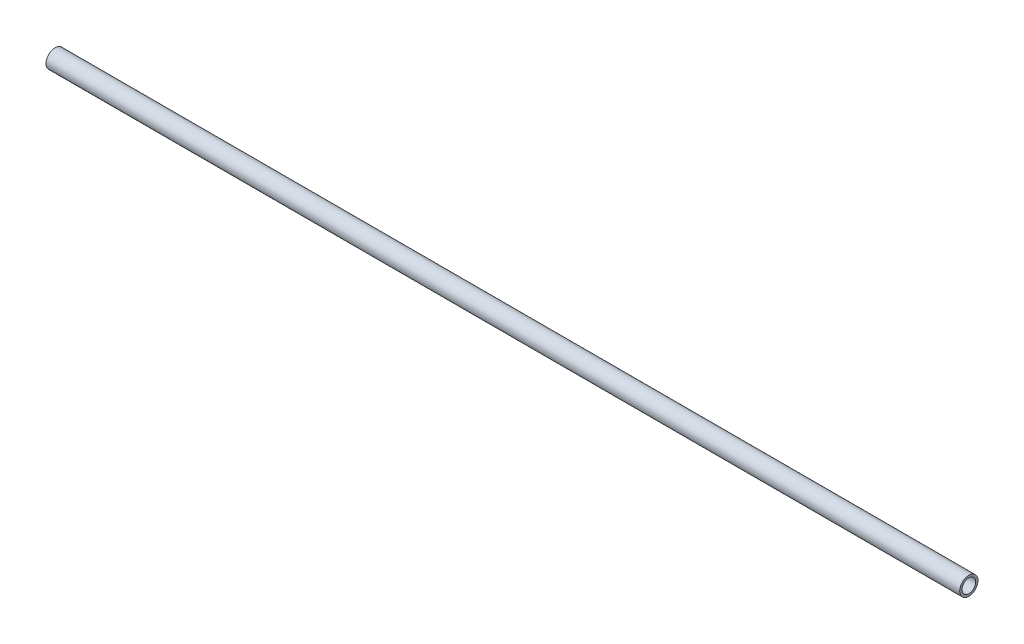
ISO-10303-21;
HEADER;
FILE_DESCRIPTION(('STEP AP214'),'2;1');
FILE_NAME('part.step','',(''),(''),'','','');
FILE_SCHEMA(('AUTOMOTIVE_DESIGN { 1 0 10303 214 1 1 1 1 }'));
ENDSEC;
DATA;
#1=APPLICATION_CONTEXT('core data for automotive mechanical design processes');
#2=APPLICATION_PROTOCOL_DEFINITION('international standard','automotive_design',2000,#1);
#3=PRODUCT_CONTEXT('',#1,'mechanical');
#4=PRODUCT('Part','Part','',(#3));
#5=PRODUCT_RELATED_PRODUCT_CATEGORY('part','',(#4));
#6=PRODUCT_DEFINITION_FORMATION('','',#4);
#7=PRODUCT_DEFINITION_CONTEXT('part definition',#1,'design');
#8=PRODUCT_DEFINITION('design','',#6,#7);
#9=PRODUCT_DEFINITION_SHAPE('','',#8);
#10=(LENGTH_UNIT() NAMED_UNIT(*) SI_UNIT(.MILLI.,.METRE.));
#11=(NAMED_UNIT(*) PLANE_ANGLE_UNIT() SI_UNIT($,.RADIAN.));
#12=(NAMED_UNIT(*) SI_UNIT($,.STERADIAN.) SOLID_ANGLE_UNIT());
#13=UNCERTAINTY_MEASURE_WITH_UNIT(LENGTH_MEASURE(1.E-05),#10,'distance_accuracy_value','');
#14=(GEOMETRIC_REPRESENTATION_CONTEXT(3) GLOBAL_UNCERTAINTY_ASSIGNED_CONTEXT((#13)) GLOBAL_UNIT_ASSIGNED_CONTEXT((#10,
#11,#12)) REPRESENTATION_CONTEXT('',''));
#15=CARTESIAN_POINT('',(0.,0.,0.));
#16=DIRECTION('',(0.,0.,1.));
#17=DIRECTION('',(1.,0.,0.));
#18=AXIS2_PLACEMENT_3D('',#15,#16,#17);
#19=CARTESIAN_POINT('',(200.,0.,0.));
#20=DIRECTION('',(1.,0.,0.));
#21=DIRECTION('',(0.,0.,-1.));
#22=AXIS2_PLACEMENT_3D('',#19,#20,#21);
#23=PLANE('',#22);
#24=CARTESIAN_POINT('',(200.,0.,0.));
#25=DIRECTION('',(1.,0.,0.));
#26=DIRECTION('',(0.,0.,-1.));
#27=AXIS2_PLACEMENT_3D('',#24,#25,#26);
#28=CIRCLE('',#27,4.);
#29=CARTESIAN_POINT('',(200.,0.,-4.));
#30=VERTEX_POINT('',#29);
#31=EDGE_CURVE('E10',#30,#30,#28,.T.);
#32=ORIENTED_EDGE('',*,*,#31,.T.);
#33=EDGE_LOOP('',(#32));
#34=FACE_BOUND('',#33,.T.);
#35=CARTESIAN_POINT('',(200.,0.,0.));
#36=DIRECTION('',(1.,0.,0.));
#37=DIRECTION('',(0.,0.,-1.));
#38=AXIS2_PLACEMENT_3D('',#35,#36,#37);
#39=CIRCLE('',#38,3.);
#40=CARTESIAN_POINT('',(200.,0.,-3.));
#41=VERTEX_POINT('',#40);
#42=EDGE_CURVE('E48',#41,#41,#39,.T.);
#43=ORIENTED_EDGE('',*,*,#42,.F.);
#44=EDGE_LOOP('',(#43));
#45=FACE_BOUND('',#44,.T.);
#46=ADVANCED_FACE('F37',(#34,#45),#23,.T.);
#47=CARTESIAN_POINT('',(-200.,0.,0.));
#48=DIRECTION('',(1.,0.,0.));
#49=DIRECTION('',(0.,0.,-1.));
#50=AXIS2_PLACEMENT_3D('',#47,#48,#49);
#51=PLANE('',#50);
#52=CARTESIAN_POINT('',(-200.,0.,0.));
#53=DIRECTION('',(1.,0.,0.));
#54=DIRECTION('',(0.,0.,-1.));
#55=AXIS2_PLACEMENT_3D('',#52,#53,#54);
#56=CIRCLE('',#55,4.);
#57=CARTESIAN_POINT('',(-200.,0.,-4.));
#58=VERTEX_POINT('',#57);
#59=EDGE_CURVE('E41',#58,#58,#56,.T.);
#60=ORIENTED_EDGE('',*,*,#59,.F.);
#61=EDGE_LOOP('',(#60));
#62=FACE_BOUND('',#61,.T.);
#63=CARTESIAN_POINT('',(-200.,0.,0.));
#64=DIRECTION('',(1.,0.,0.));
#65=DIRECTION('',(0.,0.,-1.));
#66=AXIS2_PLACEMENT_3D('',#63,#64,#65);
#67=CIRCLE('',#66,3.);
#68=CARTESIAN_POINT('',(-200.,0.,-3.));
#69=VERTEX_POINT('',#68);
#70=EDGE_CURVE('E50',#69,#69,#67,.T.);
#71=ORIENTED_EDGE('',*,*,#70,.T.);
#72=EDGE_LOOP('',(#71));
#73=FACE_BOUND('',#72,.T.);
#74=ADVANCED_FACE('F60',(#62,#73),#51,.F.);
#75=CARTESIAN_POINT('',(200.,0.,0.));
#76=DIRECTION('',(-1.,0.,0.));
#77=DIRECTION('',(0.,0.,1.));
#78=AXIS2_PLACEMENT_3D('',#75,#76,#77);
#79=CYLINDRICAL_SURFACE('',#78,4.);
#80=ORIENTED_EDGE('',*,*,#31,.F.);
#81=EDGE_LOOP('',(#80));
#82=FACE_BOUND('',#81,.T.);
#83=ORIENTED_EDGE('',*,*,#59,.T.);
#84=EDGE_LOOP('',(#83));
#85=FACE_BOUND('',#84,.T.);
#86=ADVANCED_FACE('F39',(#82,#85),#79,.T.);
#87=CARTESIAN_POINT('',(200.,0.,0.));
#88=DIRECTION('',(-1.,0.,0.));
#89=DIRECTION('',(0.,0.,1.));
#90=AXIS2_PLACEMENT_3D('',#87,#88,#89);
#91=CYLINDRICAL_SURFACE('',#90,3.);
#92=ORIENTED_EDGE('',*,*,#42,.T.);
#93=EDGE_LOOP('',(#92));
#94=FACE_BOUND('',#93,.T.);
#95=ORIENTED_EDGE('',*,*,#70,.F.);
#96=EDGE_LOOP('',(#95));
#97=FACE_BOUND('',#96,.T.);
#98=ADVANCED_FACE('F56',(#94,#97),#91,.F.);
#99=CLOSED_SHELL('',(#46,#74,#86,#98));
#100=MANIFOLD_SOLID_BREP('B2',#99);
#101=ADVANCED_BREP_SHAPE_REPRESENTATION('',(#18,#100),#14);
#102=SHAPE_DEFINITION_REPRESENTATION(#9,#101);
ENDSEC;
END-ISO-10303-21;
